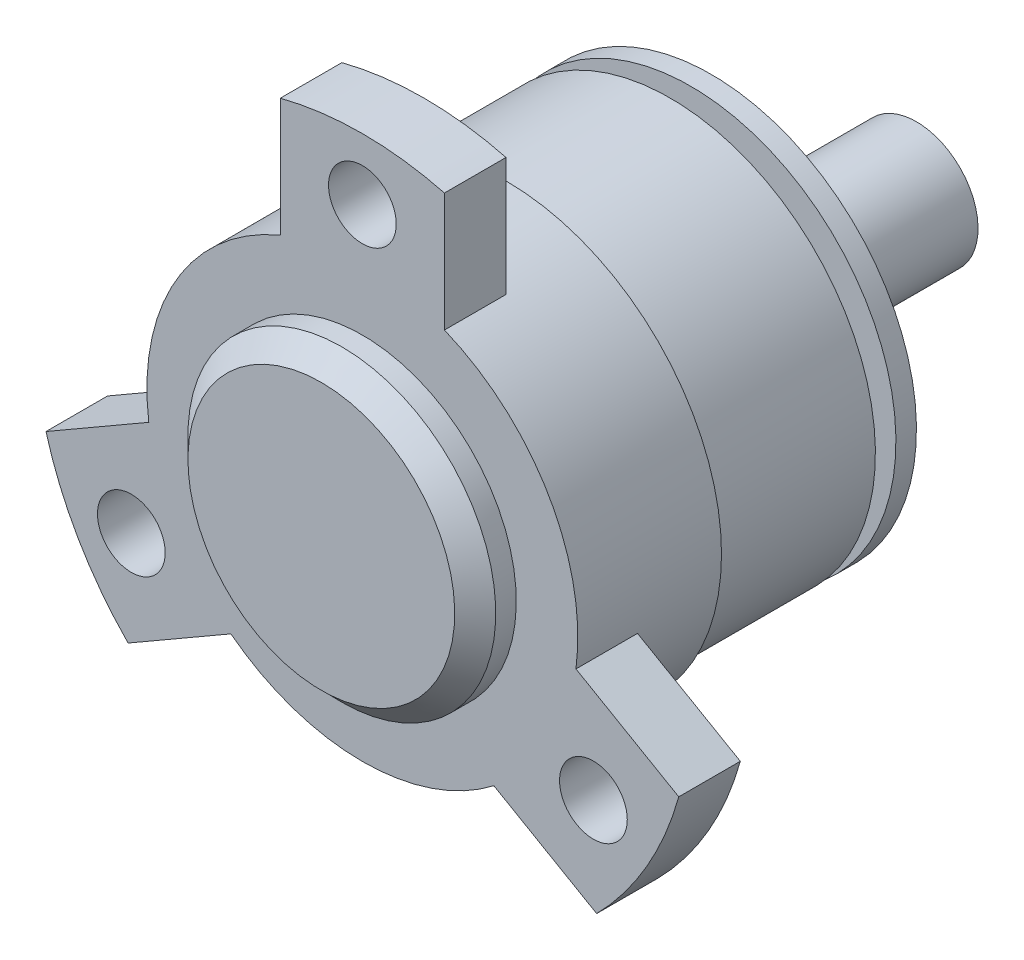
ISO-10303-21;
HEADER;
FILE_DESCRIPTION(('STEP AP214'),'2;1');
FILE_NAME('part.step','',(''),(''),'','','');
FILE_SCHEMA(('AUTOMOTIVE_DESIGN { 1 0 10303 214 1 1 1 1 }'));
ENDSEC;
DATA;
#1=APPLICATION_CONTEXT('core data for automotive mechanical design processes');
#2=APPLICATION_PROTOCOL_DEFINITION('international standard','automotive_design',2000,#1);
#3=PRODUCT_CONTEXT('',#1,'mechanical');
#4=PRODUCT('Part','Part','',(#3));
#5=PRODUCT_RELATED_PRODUCT_CATEGORY('part','',(#4));
#6=PRODUCT_DEFINITION_FORMATION('','',#4);
#7=PRODUCT_DEFINITION_CONTEXT('part definition',#1,'design');
#8=PRODUCT_DEFINITION('design','',#6,#7);
#9=PRODUCT_DEFINITION_SHAPE('','',#8);
#10=(LENGTH_UNIT() NAMED_UNIT(*) SI_UNIT(.MILLI.,.METRE.));
#11=(NAMED_UNIT(*) PLANE_ANGLE_UNIT() SI_UNIT($,.RADIAN.));
#12=(NAMED_UNIT(*) SI_UNIT($,.STERADIAN.) SOLID_ANGLE_UNIT());
#13=UNCERTAINTY_MEASURE_WITH_UNIT(LENGTH_MEASURE(1.E-05),#10,'distance_accuracy_value','');
#14=(GEOMETRIC_REPRESENTATION_CONTEXT(3) GLOBAL_UNCERTAINTY_ASSIGNED_CONTEXT((#13)) GLOBAL_UNIT_ASSIGNED_CONTEXT((#10,
#11,#12)) REPRESENTATION_CONTEXT('',''));
#15=CARTESIAN_POINT('',(0.,0.,0.));
#16=DIRECTION('',(0.,0.,1.));
#17=DIRECTION('',(1.,0.,0.));
#18=AXIS2_PLACEMENT_3D('',#15,#16,#17);
#19=CARTESIAN_POINT('',(0.,7.5,-2.));
#20=DIRECTION('',(0.,0.,-1.));
#21=DIRECTION('',(0.,1.,0.));
#22=AXIS2_PLACEMENT_3D('',#19,#20,#21);
#23=PLANE('',#22);
#24=CARTESIAN_POINT('',(0.,0.,-2.));
#25=DIRECTION('',(0.,0.,1.));
#26=DIRECTION('',(0.,-1.,0.));
#27=AXIS2_PLACEMENT_3D('',#24,#25,#26);
#28=CIRCLE('',#27,7.5);
#29=CARTESIAN_POINT('',(0.,-7.5,-2.));
#30=VERTEX_POINT('',#29);
#31=EDGE_CURVE('E245',#30,#30,#28,.T.);
#32=ORIENTED_EDGE('',*,*,#31,.F.);
#33=EDGE_LOOP('',(#32));
#34=FACE_BOUND('',#33,.T.);
#35=CARTESIAN_POINT('',(-11.2583302491974,-6.50000000000017,-2.));
#36=DIRECTION('',(0.,0.,1.));
#37=DIRECTION('',(1.,0.,0.));
#38=AXIS2_PLACEMENT_3D('',#35,#36,#37);
#39=CIRCLE('',#38,1.64999999999999);
#40=CARTESIAN_POINT('',(-9.60833024919742,-6.50000000000017,-2.));
#41=VERTEX_POINT('',#40);
#42=EDGE_CURVE('E198',#41,#41,#39,.T.);
#43=ORIENTED_EDGE('',*,*,#42,.F.);
#44=EDGE_LOOP('',(#43));
#45=FACE_BOUND('',#44,.T.);
#46=CARTESIAN_POINT('',(11.258330249198,-6.49999999999983,-2.));
#47=DIRECTION('',(0.,0.,1.));
#48=DIRECTION('',(1.,0.,0.));
#49=AXIS2_PLACEMENT_3D('',#46,#47,#48);
#50=CIRCLE('',#49,1.64999999999999);
#51=CARTESIAN_POINT('',(12.908330249198,-6.49999999999983,-2.));
#52=VERTEX_POINT('',#51);
#53=EDGE_CURVE('E194',#52,#52,#50,.T.);
#54=ORIENTED_EDGE('',*,*,#53,.F.);
#55=EDGE_LOOP('',(#54));
#56=FACE_BOUND('',#55,.T.);
#57=CARTESIAN_POINT('',(0.,13.,-2.));
#58=DIRECTION('',(0.,0.,1.));
#59=DIRECTION('',(1.,0.,0.));
#60=AXIS2_PLACEMENT_3D('',#57,#58,#59);
#61=CIRCLE('',#60,1.64999999999999);
#62=CARTESIAN_POINT('',(1.64999999999999,13.,-2.));
#63=VERTEX_POINT('',#62);
#64=EDGE_CURVE('E189',#63,#63,#61,.T.);
#65=ORIENTED_EDGE('',*,*,#64,.F.);
#66=EDGE_LOOP('',(#65));
#67=FACE_BOUND('',#66,.T.);
#68=DIRECTION('',(0.,-1.,0.));
#69=VECTOR('',#68,1.);
#70=CARTESIAN_POINT('',(-4.,15.4919333848297,-2.));
#71=LINE('',#70,#69);
#72=CARTESIAN_POINT('',(-4.,15.4919333848297,-2.));
#73=VERTEX_POINT('',#72);
#74=CARTESIAN_POINT('',(-4.,9.7082439194738,-2.));
#75=VERTEX_POINT('',#74);
#76=EDGE_CURVE('E122',#73,#75,#71,.T.);
#77=ORIENTED_EDGE('',*,*,#76,.T.);
#78=CARTESIAN_POINT('',(0.,0.,-2.));
#79=DIRECTION('',(0.,0.,1.));
#80=DIRECTION('',(1.,0.,0.));
#81=AXIS2_PLACEMENT_3D('',#78,#79,#80);
#82=CIRCLE('',#81,10.5);
#83=CARTESIAN_POINT('',(-10.4075858604001,-1.39002034459915,-2.));
#84=VERTEX_POINT('',#83);
#85=EDGE_CURVE('E131',#75,#84,#82,.T.);
#86=ORIENTED_EDGE('',*,*,#85,.T.);
#87=DIRECTION('',(-0.866025403784417,-0.500000000000038,0.));
#88=VECTOR('',#87,1.);
#89=CARTESIAN_POINT('',(-15.4164078649985,-4.28186507727723,-2.));
#90=LINE('',#89,#88);
#91=CARTESIAN_POINT('',(-15.4164078649985,-4.28186507727724,-2.));
#92=VERTEX_POINT('',#91);
#93=EDGE_CURVE('E138',#84,#92,#90,.T.);
#94=ORIENTED_EDGE('',*,*,#93,.T.);
#95=CARTESIAN_POINT('',(0.,0.,-2.));
#96=DIRECTION('',(0.,0.,1.));
#97=DIRECTION('',(0.,-1.,0.));
#98=AXIS2_PLACEMENT_3D('',#95,#96,#97);
#99=CIRCLE('',#98,16.);
#100=CARTESIAN_POINT('',(-11.4164078649985,-11.2100683075527,-2.));
#101=VERTEX_POINT('',#100);
#102=EDGE_CURVE('E240',#92,#101,#99,.T.);
#103=ORIENTED_EDGE('',*,*,#102,.T.);
#104=DIRECTION('',(0.866025403784417,0.500000000000038,0.));
#105=VECTOR('',#104,1.);
#106=CARTESIAN_POINT('',(-11.4164078649985,-11.2100683075527,-2.));
#107=LINE('',#106,#105);
#108=CARTESIAN_POINT('',(-6.40758586040012,-8.31822357487466,-2.));
#109=VERTEX_POINT('',#108);
#110=EDGE_CURVE('E150',#101,#109,#107,.T.);
#111=ORIENTED_EDGE('',*,*,#110,.T.);
#112=CARTESIAN_POINT('',(0.,0.,-2.));
#113=DIRECTION('',(0.,0.,1.));
#114=DIRECTION('',(1.,0.,0.));
#115=AXIS2_PLACEMENT_3D('',#112,#113,#114);
#116=CIRCLE('',#115,10.5);
#117=CARTESIAN_POINT('',(6.40758586040012,-8.31822357487465,-2.));
#118=VERTEX_POINT('',#117);
#119=EDGE_CURVE('E153',#109,#118,#116,.T.);
#120=ORIENTED_EDGE('',*,*,#119,.T.);
#121=DIRECTION('',(0.866025403784432,-0.500000000000011,0.));
#122=VECTOR('',#121,1.);
#123=CARTESIAN_POINT('',(11.4164078649987,-11.2100683075526,-2.));
#124=LINE('',#123,#122);
#125=CARTESIAN_POINT('',(11.4164078649987,-11.2100683075526,-2.));
#126=VERTEX_POINT('',#125);
#127=EDGE_CURVE('E156',#118,#126,#124,.T.);
#128=ORIENTED_EDGE('',*,*,#127,.T.);
#129=CARTESIAN_POINT('',(15.4164078649987,-4.28186507727715,-2.));
#130=VERTEX_POINT('',#129);
#131=EDGE_CURVE('E242',#126,#130,#99,.T.);
#132=ORIENTED_EDGE('',*,*,#131,.T.);
#133=DIRECTION('',(-0.866025403784432,0.500000000000011,0.));
#134=VECTOR('',#133,1.);
#135=CARTESIAN_POINT('',(15.4164078649987,-4.28186507727715,-2.));
#136=LINE('',#135,#134);
#137=CARTESIAN_POINT('',(10.4075858604001,-1.39002034459915,-2.));
#138=VERTEX_POINT('',#137);
#139=EDGE_CURVE('E159',#130,#138,#136,.T.);
#140=ORIENTED_EDGE('',*,*,#139,.T.);
#141=CARTESIAN_POINT('',(0.,0.,-2.));
#142=DIRECTION('',(0.,0.,1.));
#143=DIRECTION('',(1.,0.,0.));
#144=AXIS2_PLACEMENT_3D('',#141,#142,#143);
#145=CIRCLE('',#144,10.5);
#146=CARTESIAN_POINT('',(4.,9.7082439194738,-2.));
#147=VERTEX_POINT('',#146);
#148=EDGE_CURVE('E162',#138,#147,#145,.T.);
#149=ORIENTED_EDGE('',*,*,#148,.T.);
#150=DIRECTION('',(0.,1.,0.));
#151=VECTOR('',#150,1.);
#152=CARTESIAN_POINT('',(4.,15.4919333848297,-2.));
#153=LINE('',#152,#151);
#154=CARTESIAN_POINT('',(4.,15.4919333848297,-2.));
#155=VERTEX_POINT('',#154);
#156=EDGE_CURVE('E165',#147,#155,#153,.T.);
#157=ORIENTED_EDGE('',*,*,#156,.T.);
#158=EDGE_CURVE('E143',#155,#73,#99,.T.);
#159=ORIENTED_EDGE('',*,*,#158,.T.);
#160=EDGE_LOOP('',(#77,#86,#94,#103,#111,#120,#128,#132,#140,#149,#157,#159));
#161=FACE_BOUND('',#160,.T.);
#162=ADVANCED_FACE('F32',(#34,#45,#56,#67,#161),#23,.F.);
#163=CARTESIAN_POINT('',(0.,0.,0.));
#164=DIRECTION('',(0.,0.,1.));
#165=DIRECTION('',(0.,-1.,0.));
#166=AXIS2_PLACEMENT_3D('',#163,#164,#165);
#167=CYLINDRICAL_SURFACE('',#166,16.);
#168=DIRECTION('',(0.,0.,1.));
#169=VECTOR('',#168,1.);
#170=CARTESIAN_POINT('',(-4.,15.4919333848297,-52.8362015376415));
#171=LINE('',#170,#169);
#172=CARTESIAN_POINT('',(-4.,15.4919333848297,-5.));
#173=VERTEX_POINT('',#172);
#174=EDGE_CURVE('E128',#173,#73,#171,.T.);
#175=ORIENTED_EDGE('',*,*,#174,.T.);
#176=ORIENTED_EDGE('',*,*,#158,.F.);
#177=DIRECTION('',(0.,0.,1.));
#178=VECTOR('',#177,1.);
#179=CARTESIAN_POINT('',(4.,15.4919333848297,-52.8362015376415));
#180=LINE('',#179,#178);
#181=CARTESIAN_POINT('',(4.,15.4919333848297,-5.));
#182=VERTEX_POINT('',#181);
#183=EDGE_CURVE('E167',#182,#155,#180,.T.);
#184=ORIENTED_EDGE('',*,*,#183,.F.);
#185=CARTESIAN_POINT('',(0.,0.,-5.));
#186=DIRECTION('',(0.,0.,1.));
#187=DIRECTION('',(0.,-1.,0.));
#188=AXIS2_PLACEMENT_3D('',#185,#186,#187);
#189=CIRCLE('',#188,16.);
#190=EDGE_CURVE('E241',#182,#173,#189,.T.);
#191=ORIENTED_EDGE('',*,*,#190,.T.);
#192=EDGE_LOOP('',(#175,#176,#184,#191));
#193=FACE_BOUND('',#192,.T.);
#194=ADVANCED_FACE('F267',(#193),#167,.T.);
#195=DIRECTION('',(0.,0.,1.));
#196=VECTOR('',#195,1.);
#197=CARTESIAN_POINT('',(-15.4164078649985,-4.28186507727724,-52.8362015376415));
#198=LINE('',#197,#196);
#199=CARTESIAN_POINT('',(-15.4164078649985,-4.28186507727726,-5.));
#200=VERTEX_POINT('',#199);
#201=EDGE_CURVE('E184',#200,#92,#198,.T.);
#202=ORIENTED_EDGE('',*,*,#201,.F.);
#203=CARTESIAN_POINT('',(-11.4164078649984,-11.2100683075527,-5.));
#204=VERTEX_POINT('',#203);
#205=EDGE_CURVE('E235',#200,#204,#189,.T.);
#206=ORIENTED_EDGE('',*,*,#205,.T.);
#207=DIRECTION('',(0.,0.,1.));
#208=VECTOR('',#207,1.);
#209=CARTESIAN_POINT('',(-11.4164078649985,-11.2100683075527,-52.8362015376415));
#210=LINE('',#209,#208);
#211=EDGE_CURVE('E181',#204,#101,#210,.T.);
#212=ORIENTED_EDGE('',*,*,#211,.T.);
#213=ORIENTED_EDGE('',*,*,#102,.F.);
#214=EDGE_LOOP('',(#202,#206,#212,#213));
#215=FACE_BOUND('',#214,.T.);
#216=ADVANCED_FACE('F273',(#215),#167,.T.);
#217=DIRECTION('',(0.,0.,1.));
#218=VECTOR('',#217,1.);
#219=CARTESIAN_POINT('',(11.4164078649987,-11.2100683075526,-52.8362015376415));
#220=LINE('',#219,#218);
#221=CARTESIAN_POINT('',(11.4164078649987,-11.2100683075526,-5.));
#222=VERTEX_POINT('',#221);
#223=EDGE_CURVE('E176',#222,#126,#220,.T.);
#224=ORIENTED_EDGE('',*,*,#223,.F.);
#225=CARTESIAN_POINT('',(15.4164078649987,-4.28186507727715,-5.));
#226=VERTEX_POINT('',#225);
#227=EDGE_CURVE('E237',#222,#226,#189,.T.);
#228=ORIENTED_EDGE('',*,*,#227,.T.);
#229=DIRECTION('',(0.,0.,1.));
#230=VECTOR('',#229,1.);
#231=CARTESIAN_POINT('',(15.4164078649987,-4.28186507727715,-52.8362015376415));
#232=LINE('',#231,#230);
#233=EDGE_CURVE('E173',#226,#130,#232,.T.);
#234=ORIENTED_EDGE('',*,*,#233,.T.);
#235=ORIENTED_EDGE('',*,*,#131,.F.);
#236=EDGE_LOOP('',(#224,#228,#234,#235));
#237=FACE_BOUND('',#236,.T.);
#238=ADVANCED_FACE('F276',(#237),#167,.T.);
#239=CARTESIAN_POINT('',(0.,10.5,-5.));
#240=DIRECTION('',(0.,0.,1.));
#241=DIRECTION('',(0.,-1.,0.));
#242=AXIS2_PLACEMENT_3D('',#239,#240,#241);
#243=PLANE('',#242);
#244=CARTESIAN_POINT('',(0.,13.,-5.));
#245=DIRECTION('',(0.,0.,1.));
#246=DIRECTION('',(0.,-1.,0.));
#247=AXIS2_PLACEMENT_3D('',#244,#245,#246);
#248=CIRCLE('',#247,1.64999999999999);
#249=CARTESIAN_POINT('',(0.,11.35,-5.));
#250=VERTEX_POINT('',#249);
#251=EDGE_CURVE('E192',#250,#250,#248,.T.);
#252=ORIENTED_EDGE('',*,*,#251,.T.);
#253=EDGE_LOOP('',(#252));
#254=FACE_BOUND('',#253,.T.);
#255=DIRECTION('',(0.,1.,0.));
#256=VECTOR('',#255,1.);
#257=CARTESIAN_POINT('',(-4.,15.4919333848297,-5.));
#258=LINE('',#257,#256);
#259=CARTESIAN_POINT('',(-4.,9.7082439194738,-5.));
#260=VERTEX_POINT('',#259);
#261=EDGE_CURVE('E125',#260,#173,#258,.T.);
#262=ORIENTED_EDGE('',*,*,#261,.T.);
#263=ORIENTED_EDGE('',*,*,#190,.F.);
#264=DIRECTION('',(0.,-1.,0.));
#265=VECTOR('',#264,1.);
#266=CARTESIAN_POINT('',(4.,15.4919333848297,-5.));
#267=LINE('',#266,#265);
#268=CARTESIAN_POINT('',(4.,9.7082439194738,-5.));
#269=VERTEX_POINT('',#268);
#270=EDGE_CURVE('E146',#182,#269,#267,.T.);
#271=ORIENTED_EDGE('',*,*,#270,.T.);
#272=CARTESIAN_POINT('',(0.,0.,-5.));
#273=DIRECTION('',(0.,0.,1.));
#274=DIRECTION('',(0.,-1.,0.));
#275=AXIS2_PLACEMENT_3D('',#272,#273,#274);
#276=CIRCLE('',#275,10.5);
#277=EDGE_CURVE('E236',#269,#260,#276,.T.);
#278=ORIENTED_EDGE('',*,*,#277,.T.);
#279=EDGE_LOOP('',(#262,#263,#271,#278));
#280=FACE_BOUND('',#279,.T.);
#281=ADVANCED_FACE('F291',(#254,#280),#243,.F.);
#282=CARTESIAN_POINT('',(-11.2583302491974,-6.50000000000017,-5.));
#283=DIRECTION('',(0.,0.,1.));
#284=DIRECTION('',(0.,-1.,0.));
#285=AXIS2_PLACEMENT_3D('',#282,#283,#284);
#286=CIRCLE('',#285,1.64999999999999);
#287=CARTESIAN_POINT('',(-11.2583302491974,-8.15000000000016,-5.));
#288=VERTEX_POINT('',#287);
#289=EDGE_CURVE('E201',#288,#288,#286,.T.);
#290=ORIENTED_EDGE('',*,*,#289,.T.);
#291=EDGE_LOOP('',(#290));
#292=FACE_BOUND('',#291,.T.);
#293=DIRECTION('',(0.866025403784417,0.500000000000038,0.));
#294=VECTOR('',#293,1.);
#295=CARTESIAN_POINT('',(-15.4164078649985,-4.28186507727722,-5.));
#296=LINE('',#295,#294);
#297=CARTESIAN_POINT('',(-10.4075858604001,-1.39002034459915,-5.));
#298=VERTEX_POINT('',#297);
#299=EDGE_CURVE('E193',#200,#298,#296,.T.);
#300=ORIENTED_EDGE('',*,*,#299,.T.);
#301=CARTESIAN_POINT('',(-6.40758586040012,-8.31822357487466,-5.));
#302=VERTEX_POINT('',#301);
#303=EDGE_CURVE('E231',#298,#302,#276,.T.);
#304=ORIENTED_EDGE('',*,*,#303,.T.);
#305=DIRECTION('',(-0.866025403784417,-0.500000000000038,0.));
#306=VECTOR('',#305,1.);
#307=CARTESIAN_POINT('',(-11.4164078649985,-11.2100683075527,-5.));
#308=LINE('',#307,#306);
#309=EDGE_CURVE('E320',#302,#204,#308,.T.);
#310=ORIENTED_EDGE('',*,*,#309,.T.);
#311=ORIENTED_EDGE('',*,*,#205,.F.);
#312=EDGE_LOOP('',(#300,#304,#310,#311));
#313=FACE_BOUND('',#312,.T.);
#314=ADVANCED_FACE('F289',(#292,#313),#243,.F.);
#315=CARTESIAN_POINT('',(11.258330249198,-6.49999999999983,-5.));
#316=DIRECTION('',(0.,0.,1.));
#317=DIRECTION('',(0.,-1.,0.));
#318=AXIS2_PLACEMENT_3D('',#315,#316,#317);
#319=CIRCLE('',#318,1.64999999999999);
#320=CARTESIAN_POINT('',(11.258330249198,-8.14999999999982,-5.));
#321=VERTEX_POINT('',#320);
#322=EDGE_CURVE('E197',#321,#321,#319,.T.);
#323=ORIENTED_EDGE('',*,*,#322,.T.);
#324=EDGE_LOOP('',(#323));
#325=FACE_BOUND('',#324,.T.);
#326=DIRECTION('',(-0.866025403784432,0.500000000000011,0.));
#327=VECTOR('',#326,1.);
#328=CARTESIAN_POINT('',(11.4164078649987,-11.2100683075526,-5.));
#329=LINE('',#328,#327);
#330=CARTESIAN_POINT('',(6.40758586040012,-8.31822357487465,-5.));
#331=VERTEX_POINT('',#330);
#332=EDGE_CURVE('E322',#222,#331,#329,.T.);
#333=ORIENTED_EDGE('',*,*,#332,.T.);
#334=CARTESIAN_POINT('',(10.4075858604001,-1.39002034459914,-5.));
#335=VERTEX_POINT('',#334);
#336=EDGE_CURVE('E232',#331,#335,#276,.T.);
#337=ORIENTED_EDGE('',*,*,#336,.T.);
#338=DIRECTION('',(0.866025403784432,-0.500000000000011,0.));
#339=VECTOR('',#338,1.);
#340=CARTESIAN_POINT('',(15.4164078649987,-4.28186507727715,-5.));
#341=LINE('',#340,#339);
#342=EDGE_CURVE('E326',#335,#226,#341,.T.);
#343=ORIENTED_EDGE('',*,*,#342,.T.);
#344=ORIENTED_EDGE('',*,*,#227,.F.);
#345=EDGE_LOOP('',(#333,#337,#343,#344));
#346=FACE_BOUND('',#345,.T.);
#347=ADVANCED_FACE('F285',(#325,#346),#243,.F.);
#348=CARTESIAN_POINT('',(0.,0.,0.));
#349=DIRECTION('',(0.,0.,-1.));
#350=DIRECTION('',(0.,1.,0.));
#351=AXIS2_PLACEMENT_3D('',#348,#349,#350);
#352=PLANE('',#351);
#353=CARTESIAN_POINT('',(0.,0.,0.));
#354=DIRECTION('',(0.,0.,-1.));
#355=DIRECTION('',(0.,1.,0.));
#356=AXIS2_PLACEMENT_3D('',#353,#354,#355);
#357=CIRCLE('',#356,6.49999999999999);
#358=CARTESIAN_POINT('',(0.,6.49999999999999,0.));
#359=VERTEX_POINT('',#358);
#360=EDGE_CURVE('E40',#359,#359,#357,.F.);
#361=ORIENTED_EDGE('',*,*,#360,.T.);
#362=EDGE_LOOP('',(#361));
#363=FACE_BOUND('',#362,.T.);
#364=ADVANCED_FACE('F254',(#363),#352,.F.);
#365=CARTESIAN_POINT('',(0.,0.,0.));
#366=DIRECTION('',(0.,0.,1.));
#367=DIRECTION('',(0.,-1.,0.));
#368=AXIS2_PLACEMENT_3D('',#365,#366,#367);
#369=CYLINDRICAL_SURFACE('',#368,7.5);
#370=CARTESIAN_POINT('',(0.,0.,-1.00000000000001));
#371=DIRECTION('',(0.,0.,-1.));
#372=DIRECTION('',(0.,1.,0.));
#373=AXIS2_PLACEMENT_3D('',#370,#371,#372);
#374=CIRCLE('',#373,7.5);
#375=CARTESIAN_POINT('',(0.,7.5,-1.00000000000001));
#376=VERTEX_POINT('',#375);
#377=EDGE_CURVE('E12',#376,#376,#374,.T.);
#378=ORIENTED_EDGE('',*,*,#377,.T.);
#379=EDGE_LOOP('',(#378));
#380=FACE_BOUND('',#379,.T.);
#381=ORIENTED_EDGE('',*,*,#31,.T.);
#382=EDGE_LOOP('',(#381));
#383=FACE_BOUND('',#382,.T.);
#384=ADVANCED_FACE('F281',(#380,#383),#369,.T.);
#385=CARTESIAN_POINT('',(0.,0.,0.));
#386=DIRECTION('',(0.,0.,1.));
#387=DIRECTION('',(0.,-1.,0.));
#388=AXIS2_PLACEMENT_3D('',#385,#386,#387);
#389=CYLINDRICAL_SURFACE('',#388,10.5);
#390=ORIENTED_EDGE('',*,*,#336,.F.);
#391=DIRECTION('',(0.,0.,1.));
#392=VECTOR('',#391,1.);
#393=CARTESIAN_POINT('',(6.40758586040012,-8.31822357487465,-52.8362015376415));
#394=LINE('',#393,#392);
#395=EDGE_CURVE('E178',#331,#118,#394,.T.);
#396=ORIENTED_EDGE('',*,*,#395,.T.);
#397=ORIENTED_EDGE('',*,*,#119,.F.);
#398=DIRECTION('',(0.,0.,1.));
#399=VECTOR('',#398,1.);
#400=CARTESIAN_POINT('',(-6.40758586040012,-8.31822357487466,-52.8362015376415));
#401=LINE('',#400,#399);
#402=EDGE_CURVE('E47',#302,#109,#401,.T.);
#403=ORIENTED_EDGE('',*,*,#402,.F.);
#404=ORIENTED_EDGE('',*,*,#303,.F.);
#405=DIRECTION('',(0.,0.,1.));
#406=VECTOR('',#405,1.);
#407=CARTESIAN_POINT('',(-10.4075858604001,-1.39002034459915,-52.8362015376415));
#408=LINE('',#407,#406);
#409=EDGE_CURVE('E127',#298,#84,#408,.T.);
#410=ORIENTED_EDGE('',*,*,#409,.T.);
#411=ORIENTED_EDGE('',*,*,#85,.F.);
#412=DIRECTION('',(0.,0.,1.));
#413=VECTOR('',#412,1.);
#414=CARTESIAN_POINT('',(-4.,9.7082439194738,-52.8362015376415));
#415=LINE('',#414,#413);
#416=EDGE_CURVE('E54',#260,#75,#415,.T.);
#417=ORIENTED_EDGE('',*,*,#416,.F.);
#418=ORIENTED_EDGE('',*,*,#277,.F.);
#419=DIRECTION('',(0.,0.,1.));
#420=VECTOR('',#419,1.);
#421=CARTESIAN_POINT('',(4.,9.7082439194738,-52.8362015376415));
#422=LINE('',#421,#420);
#423=EDGE_CURVE('E169',#269,#147,#422,.T.);
#424=ORIENTED_EDGE('',*,*,#423,.T.);
#425=ORIENTED_EDGE('',*,*,#148,.F.);
#426=DIRECTION('',(0.,0.,1.));
#427=VECTOR('',#426,1.);
#428=CARTESIAN_POINT('',(10.4075858604001,-1.39002034459915,-52.8362015376415));
#429=LINE('',#428,#427);
#430=EDGE_CURVE('E171',#335,#138,#429,.T.);
#431=ORIENTED_EDGE('',*,*,#430,.F.);
#432=EDGE_LOOP('',(#390,#396,#397,#403,#404,#410,#411,#417,#418,#424,#425,#431));
#433=FACE_BOUND('',#432,.T.);
#434=CARTESIAN_POINT('',(0.,0.,-9.));
#435=DIRECTION('',(0.,0.,1.));
#436=DIRECTION('',(0.,-1.,0.));
#437=AXIS2_PLACEMENT_3D('',#434,#435,#436);
#438=CIRCLE('',#437,10.5);
#439=CARTESIAN_POINT('',(0.,-10.5,-9.));
#440=VERTEX_POINT('',#439);
#441=EDGE_CURVE('E228',#440,#440,#438,.T.);
#442=ORIENTED_EDGE('',*,*,#441,.T.);
#443=EDGE_LOOP('',(#442));
#444=FACE_BOUND('',#443,.T.);
#445=ADVANCED_FACE('F133',(#433,#444),#389,.T.);
#446=CARTESIAN_POINT('',(0.,10.5,-9.));
#447=DIRECTION('',(0.,0.,1.));
#448=DIRECTION('',(0.,-1.,0.));
#449=AXIS2_PLACEMENT_3D('',#446,#447,#448);
#450=PLANE('',#449);
#451=ORIENTED_EDGE('',*,*,#441,.F.);
#452=EDGE_LOOP('',(#451));
#453=FACE_BOUND('',#452,.T.);
#454=CARTESIAN_POINT('',(0.,0.,-9.));
#455=DIRECTION('',(0.,0.,1.));
#456=DIRECTION('',(0.,-1.,0.));
#457=AXIS2_PLACEMENT_3D('',#454,#455,#456);
#458=CIRCLE('',#457,10.);
#459=CARTESIAN_POINT('',(0.,-10.,-9.));
#460=VERTEX_POINT('',#459);
#461=EDGE_CURVE('E225',#460,#460,#458,.T.);
#462=ORIENTED_EDGE('',*,*,#461,.T.);
#463=EDGE_LOOP('',(#462));
#464=FACE_BOUND('',#463,.T.);
#465=ADVANCED_FACE('F397',(#453,#464),#450,.F.);
#466=CARTESIAN_POINT('',(0.,0.,0.));
#467=DIRECTION('',(0.,0.,1.));
#468=DIRECTION('',(0.,-1.,0.));
#469=AXIS2_PLACEMENT_3D('',#466,#467,#468);
#470=CYLINDRICAL_SURFACE('',#469,10.);
#471=ORIENTED_EDGE('',*,*,#461,.F.);
#472=EDGE_LOOP('',(#471));
#473=FACE_BOUND('',#472,.T.);
#474=CARTESIAN_POINT('',(0.,0.,-17.));
#475=DIRECTION('',(0.,0.,1.));
#476=DIRECTION('',(0.,-1.,0.));
#477=AXIS2_PLACEMENT_3D('',#474,#475,#476);
#478=CIRCLE('',#477,10.);
#479=CARTESIAN_POINT('',(0.,-10.,-17.));
#480=VERTEX_POINT('',#479);
#481=EDGE_CURVE('E222',#480,#480,#478,.T.);
#482=ORIENTED_EDGE('',*,*,#481,.T.);
#483=EDGE_LOOP('',(#482));
#484=FACE_BOUND('',#483,.T.);
#485=ADVANCED_FACE('F393',(#473,#484),#470,.T.);
#486=CARTESIAN_POINT('',(0.,10.,-17.));
#487=DIRECTION('',(0.,0.,1.));
#488=DIRECTION('',(0.,-1.,0.));
#489=AXIS2_PLACEMENT_3D('',#486,#487,#488);
#490=PLANE('',#489);
#491=ORIENTED_EDGE('',*,*,#481,.F.);
#492=EDGE_LOOP('',(#491));
#493=FACE_BOUND('',#492,.T.);
#494=CARTESIAN_POINT('',(0.,0.,-17.));
#495=DIRECTION('',(0.,0.,1.));
#496=DIRECTION('',(0.,-1.,0.));
#497=AXIS2_PLACEMENT_3D('',#494,#495,#496);
#498=CIRCLE('',#497,8.5);
#499=CARTESIAN_POINT('',(0.,-8.50000000000001,-17.));
#500=VERTEX_POINT('',#499);
#501=EDGE_CURVE('E219',#500,#500,#498,.T.);
#502=ORIENTED_EDGE('',*,*,#501,.T.);
#503=EDGE_LOOP('',(#502));
#504=FACE_BOUND('',#503,.T.);
#505=ADVANCED_FACE('F389',(#493,#504),#490,.F.);
#506=CARTESIAN_POINT('',(0.,0.,0.));
#507=DIRECTION('',(0.,0.,1.));
#508=DIRECTION('',(0.,-1.,0.));
#509=AXIS2_PLACEMENT_3D('',#506,#507,#508);
#510=CYLINDRICAL_SURFACE('',#509,8.5);
#511=ORIENTED_EDGE('',*,*,#501,.F.);
#512=EDGE_LOOP('',(#511));
#513=FACE_BOUND('',#512,.T.);
#514=CARTESIAN_POINT('',(0.,0.,-18.));
#515=DIRECTION('',(0.,0.,1.));
#516=DIRECTION('',(0.,-1.,0.));
#517=AXIS2_PLACEMENT_3D('',#514,#515,#516);
#518=CIRCLE('',#517,8.5);
#519=CARTESIAN_POINT('',(0.,-8.5,-18.));
#520=VERTEX_POINT('',#519);
#521=EDGE_CURVE('E216',#520,#520,#518,.T.);
#522=ORIENTED_EDGE('',*,*,#521,.T.);
#523=EDGE_LOOP('',(#522));
#524=FACE_BOUND('',#523,.T.);
#525=ADVANCED_FACE('F385',(#513,#524),#510,.T.);
#526=CARTESIAN_POINT('',(0.,10.,-18.));
#527=DIRECTION('',(0.,0.,-1.));
#528=DIRECTION('',(0.,1.,0.));
#529=AXIS2_PLACEMENT_3D('',#526,#527,#528);
#530=PLANE('',#529);
#531=ORIENTED_EDGE('',*,*,#521,.F.);
#532=EDGE_LOOP('',(#531));
#533=FACE_BOUND('',#532,.T.);
#534=CARTESIAN_POINT('',(0.,0.,-18.));
#535=DIRECTION('',(0.,0.,1.));
#536=DIRECTION('',(0.,-1.,0.));
#537=AXIS2_PLACEMENT_3D('',#534,#535,#536);
#538=CIRCLE('',#537,10.);
#539=CARTESIAN_POINT('',(0.,-10.,-18.));
#540=VERTEX_POINT('',#539);
#541=EDGE_CURVE('E213',#540,#540,#538,.T.);
#542=ORIENTED_EDGE('',*,*,#541,.T.);
#543=EDGE_LOOP('',(#542));
#544=FACE_BOUND('',#543,.T.);
#545=ADVANCED_FACE('F381',(#533,#544),#530,.F.);
#546=CARTESIAN_POINT('',(0.,0.,0.));
#547=DIRECTION('',(0.,0.,1.));
#548=DIRECTION('',(0.,-1.,0.));
#549=AXIS2_PLACEMENT_3D('',#546,#547,#548);
#550=CYLINDRICAL_SURFACE('',#549,10.);
#551=ORIENTED_EDGE('',*,*,#541,.F.);
#552=EDGE_LOOP('',(#551));
#553=FACE_BOUND('',#552,.T.);
#554=CARTESIAN_POINT('',(0.,0.,-19.));
#555=DIRECTION('',(0.,0.,1.));
#556=DIRECTION('',(0.,-1.,0.));
#557=AXIS2_PLACEMENT_3D('',#554,#555,#556);
#558=CIRCLE('',#557,10.);
#559=CARTESIAN_POINT('',(0.,-10.,-19.));
#560=VERTEX_POINT('',#559);
#561=EDGE_CURVE('E210',#560,#560,#558,.T.);
#562=ORIENTED_EDGE('',*,*,#561,.T.);
#563=EDGE_LOOP('',(#562));
#564=FACE_BOUND('',#563,.T.);
#565=ADVANCED_FACE('F377',(#553,#564),#550,.T.);
#566=CARTESIAN_POINT('',(0.,2.99999999999999,-19.));
#567=DIRECTION('',(0.,0.,1.));
#568=DIRECTION('',(0.,-1.,0.));
#569=AXIS2_PLACEMENT_3D('',#566,#567,#568);
#570=PLANE('',#569);
#571=ORIENTED_EDGE('',*,*,#561,.F.);
#572=EDGE_LOOP('',(#571));
#573=FACE_BOUND('',#572,.T.);
#574=CARTESIAN_POINT('',(0.,0.,-19.));
#575=DIRECTION('',(0.,0.,1.));
#576=DIRECTION('',(0.,-1.,0.));
#577=AXIS2_PLACEMENT_3D('',#574,#575,#576);
#578=CIRCLE('',#577,2.99999999999999);
#579=CARTESIAN_POINT('',(0.,-2.99999999999999,-19.));
#580=VERTEX_POINT('',#579);
#581=EDGE_CURVE('E207',#580,#580,#578,.T.);
#582=ORIENTED_EDGE('',*,*,#581,.T.);
#583=EDGE_LOOP('',(#582));
#584=FACE_BOUND('',#583,.T.);
#585=ADVANCED_FACE('F373',(#573,#584),#570,.F.);
#586=CARTESIAN_POINT('',(0.,0.,0.));
#587=DIRECTION('',(0.,0.,1.));
#588=DIRECTION('',(0.,-1.,0.));
#589=AXIS2_PLACEMENT_3D('',#586,#587,#588);
#590=CYLINDRICAL_SURFACE('',#589,2.99999999999999);
#591=ORIENTED_EDGE('',*,*,#581,.F.);
#592=EDGE_LOOP('',(#591));
#593=FACE_BOUND('',#592,.T.);
#594=CARTESIAN_POINT('',(0.,0.,-29.));
#595=DIRECTION('',(0.,0.,1.));
#596=DIRECTION('',(0.,-1.,0.));
#597=AXIS2_PLACEMENT_3D('',#594,#595,#596);
#598=CIRCLE('',#597,2.99999999999999);
#599=CARTESIAN_POINT('',(0.,-2.99999999999999,-29.));
#600=VERTEX_POINT('',#599);
#601=EDGE_CURVE('E204',#600,#600,#598,.T.);
#602=ORIENTED_EDGE('',*,*,#601,.T.);
#603=EDGE_LOOP('',(#602));
#604=FACE_BOUND('',#603,.T.);
#605=ADVANCED_FACE('F369',(#593,#604),#590,.T.);
#606=CARTESIAN_POINT('',(0.,2.99999999999999,-29.));
#607=DIRECTION('',(0.,0.,1.));
#608=DIRECTION('',(0.,-1.,0.));
#609=AXIS2_PLACEMENT_3D('',#606,#607,#608);
#610=PLANE('',#609);
#611=ORIENTED_EDGE('',*,*,#601,.F.);
#612=EDGE_LOOP('',(#611));
#613=FACE_BOUND('',#612,.T.);
#614=ADVANCED_FACE('F365',(#613),#610,.F.);
#615=CARTESIAN_POINT('',(-11.2583302491974,-6.50000000000017,-2.));
#616=DIRECTION('',(0.,0.,1.));
#617=DIRECTION('',(1.,0.,0.));
#618=AXIS2_PLACEMENT_3D('',#615,#616,#617);
#619=CYLINDRICAL_SURFACE('',#618,1.64999999999999);
#620=ORIENTED_EDGE('',*,*,#42,.T.);
#621=EDGE_LOOP('',(#620));
#622=FACE_BOUND('',#621,.T.);
#623=ORIENTED_EDGE('',*,*,#289,.F.);
#624=EDGE_LOOP('',(#623));
#625=FACE_BOUND('',#624,.T.);
#626=ADVANCED_FACE('F361',(#622,#625),#619,.F.);
#627=CARTESIAN_POINT('',(11.258330249198,-6.49999999999983,-2.));
#628=DIRECTION('',(0.,0.,1.));
#629=DIRECTION('',(1.,0.,0.));
#630=AXIS2_PLACEMENT_3D('',#627,#628,#629);
#631=CYLINDRICAL_SURFACE('',#630,1.64999999999999);
#632=ORIENTED_EDGE('',*,*,#53,.T.);
#633=EDGE_LOOP('',(#632));
#634=FACE_BOUND('',#633,.T.);
#635=ORIENTED_EDGE('',*,*,#322,.F.);
#636=EDGE_LOOP('',(#635));
#637=FACE_BOUND('',#636,.T.);
#638=ADVANCED_FACE('F357',(#634,#637),#631,.F.);
#639=CARTESIAN_POINT('',(0.,13.,-2.));
#640=DIRECTION('',(0.,0.,1.));
#641=DIRECTION('',(1.,0.,0.));
#642=AXIS2_PLACEMENT_3D('',#639,#640,#641);
#643=CYLINDRICAL_SURFACE('',#642,1.64999999999999);
#644=ORIENTED_EDGE('',*,*,#64,.T.);
#645=EDGE_LOOP('',(#644));
#646=FACE_BOUND('',#645,.T.);
#647=ORIENTED_EDGE('',*,*,#251,.F.);
#648=EDGE_LOOP('',(#647));
#649=FACE_BOUND('',#648,.T.);
#650=ADVANCED_FACE('F349',(#646,#649),#643,.F.);
#651=CARTESIAN_POINT('',(11.4164078649987,-11.2100683075526,-52.8362015376415));
#652=DIRECTION('',(-0.500000000000011,-0.866025403784432,0.));
#653=DIRECTION('',(0.866025403784432,-0.500000000000011,0.));
#654=AXIS2_PLACEMENT_3D('',#651,#652,#653);
#655=PLANE('',#654);
#656=ORIENTED_EDGE('',*,*,#223,.T.);
#657=ORIENTED_EDGE('',*,*,#127,.F.);
#658=ORIENTED_EDGE('',*,*,#395,.F.);
#659=ORIENTED_EDGE('',*,*,#332,.F.);
#660=EDGE_LOOP('',(#656,#657,#658,#659));
#661=FACE_BOUND('',#660,.T.);
#662=ADVANCED_FACE('F338',(#661),#655,.T.);
#663=CARTESIAN_POINT('',(-11.4164078649985,-11.2100683075527,-52.8362015376415));
#664=DIRECTION('',(0.500000000000038,-0.866025403784417,0.));
#665=DIRECTION('',(0.866025403784417,0.500000000000038,0.));
#666=AXIS2_PLACEMENT_3D('',#663,#664,#665);
#667=PLANE('',#666);
#668=ORIENTED_EDGE('',*,*,#402,.T.);
#669=ORIENTED_EDGE('',*,*,#110,.F.);
#670=ORIENTED_EDGE('',*,*,#211,.F.);
#671=ORIENTED_EDGE('',*,*,#309,.F.);
#672=EDGE_LOOP('',(#668,#669,#670,#671));
#673=FACE_BOUND('',#672,.T.);
#674=ADVANCED_FACE('F339',(#673),#667,.T.);
#675=CARTESIAN_POINT('',(-15.4164078649985,-4.28186507727723,-52.8362015376415));
#676=DIRECTION('',(-0.500000000000038,0.866025403784417,0.));
#677=DIRECTION('',(-0.866025403784417,-0.500000000000038,0.));
#678=AXIS2_PLACEMENT_3D('',#675,#676,#677);
#679=PLANE('',#678);
#680=ORIENTED_EDGE('',*,*,#201,.T.);
#681=ORIENTED_EDGE('',*,*,#93,.F.);
#682=ORIENTED_EDGE('',*,*,#409,.F.);
#683=ORIENTED_EDGE('',*,*,#299,.F.);
#684=EDGE_LOOP('',(#680,#681,#682,#683));
#685=FACE_BOUND('',#684,.T.);
#686=ADVANCED_FACE('F341',(#685),#679,.T.);
#687=CARTESIAN_POINT('',(-4.,15.4919333848297,-52.8362015376415));
#688=DIRECTION('',(-1.,0.,0.));
#689=DIRECTION('',(0.,0.,1.));
#690=AXIS2_PLACEMENT_3D('',#687,#688,#689);
#691=PLANE('',#690);
#692=ORIENTED_EDGE('',*,*,#416,.T.);
#693=ORIENTED_EDGE('',*,*,#76,.F.);
#694=ORIENTED_EDGE('',*,*,#174,.F.);
#695=ORIENTED_EDGE('',*,*,#261,.F.);
#696=EDGE_LOOP('',(#692,#693,#694,#695));
#697=FACE_BOUND('',#696,.T.);
#698=ADVANCED_FACE('F120',(#697),#691,.T.);
#699=CARTESIAN_POINT('',(15.4164078649987,-4.28186507727715,-52.8362015376415));
#700=DIRECTION('',(0.500000000000011,0.866025403784432,0.));
#701=DIRECTION('',(-0.866025403784432,0.500000000000011,0.));
#702=AXIS2_PLACEMENT_3D('',#699,#700,#701);
#703=PLANE('',#702);
#704=ORIENTED_EDGE('',*,*,#430,.T.);
#705=ORIENTED_EDGE('',*,*,#139,.F.);
#706=ORIENTED_EDGE('',*,*,#233,.F.);
#707=ORIENTED_EDGE('',*,*,#342,.F.);
#708=EDGE_LOOP('',(#704,#705,#706,#707));
#709=FACE_BOUND('',#708,.T.);
#710=ADVANCED_FACE('F262',(#709),#703,.T.);
#711=CARTESIAN_POINT('',(4.,15.4919333848297,-52.8362015376415));
#712=DIRECTION('',(1.,0.,0.));
#713=DIRECTION('',(0.,0.,-1.));
#714=AXIS2_PLACEMENT_3D('',#711,#712,#713);
#715=PLANE('',#714);
#716=ORIENTED_EDGE('',*,*,#183,.T.);
#717=ORIENTED_EDGE('',*,*,#156,.F.);
#718=ORIENTED_EDGE('',*,*,#423,.F.);
#719=ORIENTED_EDGE('',*,*,#270,.F.);
#720=EDGE_LOOP('',(#716,#717,#718,#719));
#721=FACE_BOUND('',#720,.T.);
#722=ADVANCED_FACE('F257',(#721),#715,.T.);
#723=CARTESIAN_POINT('',(0.,0.,0.));
#724=DIRECTION('',(0.,0.,-1.));
#725=DIRECTION('',(0.,1.,0.));
#726=AXIS2_PLACEMENT_3D('',#723,#724,#725);
#727=CONICAL_SURFACE('',#726,6.49999999999999,0.78539816339745);
#728=ORIENTED_EDGE('',*,*,#377,.F.);
#729=EDGE_LOOP('',(#728));
#730=FACE_BOUND('',#729,.T.);
#731=ORIENTED_EDGE('',*,*,#360,.F.);
#732=EDGE_LOOP('',(#731));
#733=FACE_BOUND('',#732,.T.);
#734=ADVANCED_FACE('F34',(#730,#733),#727,.T.);
#735=CLOSED_SHELL('',(#162,#194,#216,#238,#281,#314,#347,#364,#384,#445,#465,#485,#505,#525,
#545,#565,#585,#605,#614,#626,#638,#650,#662,#674,#686,#698,#710,#722,#734));
#736=MANIFOLD_SOLID_BREP('B2',#735);
#737=ADVANCED_BREP_SHAPE_REPRESENTATION('',(#18,#736),#14);
#738=SHAPE_DEFINITION_REPRESENTATION(#9,#737);
ENDSEC;
END-ISO-10303-21;
